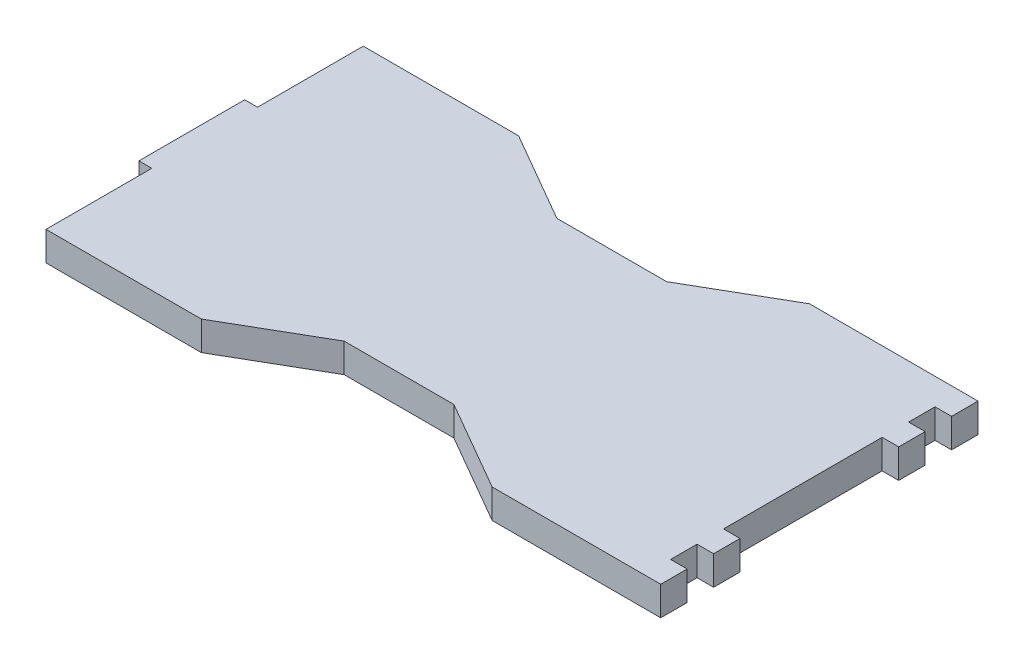
ISO-10303-21;
HEADER;
FILE_DESCRIPTION(('STEP AP214'),'2;1');
FILE_NAME('part.step','',(''),(''),'','','');
FILE_SCHEMA(('AUTOMOTIVE_DESIGN { 1 0 10303 214 1 1 1 1 }'));
ENDSEC;
DATA;
#1=APPLICATION_CONTEXT('core data for automotive mechanical design processes');
#2=APPLICATION_PROTOCOL_DEFINITION('international standard','automotive_design',2000,#1);
#3=PRODUCT_CONTEXT('',#1,'mechanical');
#4=PRODUCT('Part','Part','',(#3));
#5=PRODUCT_RELATED_PRODUCT_CATEGORY('part','',(#4));
#6=PRODUCT_DEFINITION_FORMATION('','',#4);
#7=PRODUCT_DEFINITION_CONTEXT('part definition',#1,'design');
#8=PRODUCT_DEFINITION('design','',#6,#7);
#9=PRODUCT_DEFINITION_SHAPE('','',#8);
#10=(LENGTH_UNIT() NAMED_UNIT(*) SI_UNIT(.MILLI.,.METRE.));
#11=(NAMED_UNIT(*) PLANE_ANGLE_UNIT() SI_UNIT($,.RADIAN.));
#12=(NAMED_UNIT(*) SI_UNIT($,.STERADIAN.) SOLID_ANGLE_UNIT());
#13=UNCERTAINTY_MEASURE_WITH_UNIT(LENGTH_MEASURE(1.E-05),#10,'distance_accuracy_value','');
#14=(GEOMETRIC_REPRESENTATION_CONTEXT(3) GLOBAL_UNCERTAINTY_ASSIGNED_CONTEXT((#13)) GLOBAL_UNIT_ASSIGNED_CONTEXT((#10,
#11,#12)) REPRESENTATION_CONTEXT('',''));
#15=CARTESIAN_POINT('',(0.,0.,0.));
#16=DIRECTION('',(0.,0.,1.));
#17=DIRECTION('',(1.,0.,0.));
#18=AXIS2_PLACEMENT_3D('',#15,#16,#17);
#19=CARTESIAN_POINT('',(0.,2.2,-5.32952119277333));
#20=DIRECTION('',(0.,0.,1.));
#21=DIRECTION('',(1.,0.,0.));
#22=AXIS2_PLACEMENT_3D('',#19,#20,#21);
#23=PLANE('',#22);
#24=DIRECTION('',(-1.,0.,0.));
#25=VECTOR('',#24,1.);
#26=CARTESIAN_POINT('',(0.,0.,-5.32952119277333));
#27=LINE('',#26,#25);
#28=CARTESIAN_POINT('',(-43.0000000000031,0.,-5.32952119277333));
#29=VERTEX_POINT('',#28);
#30=CARTESIAN_POINT('',(-44.2500000000012,0.,-5.32952119277333));
#31=VERTEX_POINT('',#30);
#32=EDGE_CURVE('E253',#29,#31,#27,.T.);
#33=ORIENTED_EDGE('',*,*,#32,.F.);
#34=DIRECTION('',(0.,-1.,0.));
#35=VECTOR('',#34,1.);
#36=CARTESIAN_POINT('',(-43.0000000000031,2.2,-5.32952119277333));
#37=LINE('',#36,#35);
#38=CARTESIAN_POINT('',(-43.0000000000031,2.2,-5.32952119277333));
#39=VERTEX_POINT('',#38);
#40=EDGE_CURVE('E11',#39,#29,#37,.T.);
#41=ORIENTED_EDGE('',*,*,#40,.F.);
#42=DIRECTION('',(-1.,0.,0.));
#43=VECTOR('',#42,1.);
#44=CARTESIAN_POINT('',(0.,2.2,-5.32952119277333));
#45=LINE('',#44,#43);
#46=CARTESIAN_POINT('',(-44.2500000000012,2.2,-5.32952119277333));
#47=VERTEX_POINT('',#46);
#48=EDGE_CURVE('E324',#39,#47,#45,.T.);
#49=ORIENTED_EDGE('',*,*,#48,.T.);
#50=DIRECTION('',(0.,-1.,0.));
#51=VECTOR('',#50,1.);
#52=CARTESIAN_POINT('',(-44.2500000000012,2.2,-5.32952119277333));
#53=LINE('',#52,#51);
#54=EDGE_CURVE('E147',#47,#31,#53,.T.);
#55=ORIENTED_EDGE('',*,*,#54,.T.);
#56=EDGE_LOOP('',(#33,#41,#49,#55));
#57=FACE_BOUND('',#56,.T.);
#58=ADVANCED_FACE('F37',(#57),#23,.T.);
#59=CARTESIAN_POINT('',(-42.9999999999982,2.2,2.57594871359193E-11));
#60=DIRECTION('',(-1.,0.,5.99057840370243E-13));
#61=DIRECTION('',(5.99057840370243E-13,0.,1.));
#62=AXIS2_PLACEMENT_3D('',#59,#60,#61);
#63=PLANE('',#62);
#64=DIRECTION('',(-5.99057840370243E-13,0.,-1.));
#65=VECTOR('',#64,1.);
#66=CARTESIAN_POINT('',(-42.9999999999982,0.,2.57594871359193E-11));
#67=LINE('',#66,#65);
#68=CARTESIAN_POINT('',(-43.0000000000031,0.,-7.32952119277339));
#69=VERTEX_POINT('',#68);
#70=EDGE_CURVE('E256',#29,#69,#67,.T.);
#71=ORIENTED_EDGE('',*,*,#70,.T.);
#72=DIRECTION('',(0.,-1.,0.));
#73=VECTOR('',#72,1.);
#74=CARTESIAN_POINT('',(-43.0000000000031,2.2,-7.32952119277339));
#75=LINE('',#74,#73);
#76=CARTESIAN_POINT('',(-43.0000000000031,2.2,-7.32952119277339));
#77=VERTEX_POINT('',#76);
#78=EDGE_CURVE('E45',#77,#69,#75,.T.);
#79=ORIENTED_EDGE('',*,*,#78,.F.);
#80=DIRECTION('',(-5.99057840370243E-13,0.,-1.));
#81=VECTOR('',#80,1.);
#82=CARTESIAN_POINT('',(-42.9999999999982,2.2,2.57594871359193E-11));
#83=LINE('',#82,#81);
#84=EDGE_CURVE('E399',#39,#77,#83,.T.);
#85=ORIENTED_EDGE('',*,*,#84,.F.);
#86=ORIENTED_EDGE('',*,*,#40,.T.);
#87=EDGE_LOOP('',(#71,#79,#85,#86));
#88=FACE_BOUND('',#87,.T.);
#89=ADVANCED_FACE('F386',(#88),#63,.F.);
#90=CARTESIAN_POINT('',(0.,2.2,-7.32952119277339));
#91=DIRECTION('',(0.,0.,-1.));
#92=DIRECTION('',(-1.,0.,0.));
#93=AXIS2_PLACEMENT_3D('',#90,#91,#92);
#94=PLANE('',#93);
#95=DIRECTION('',(1.,0.,0.));
#96=VECTOR('',#95,1.);
#97=CARTESIAN_POINT('',(0.,0.,-7.32952119277339));
#98=LINE('',#97,#96);
#99=CARTESIAN_POINT('',(-44.2500000000011,0.,-7.32952119277339));
#100=VERTEX_POINT('',#99);
#101=EDGE_CURVE('E259',#100,#69,#98,.T.);
#102=ORIENTED_EDGE('',*,*,#101,.F.);
#103=DIRECTION('',(0.,-1.,0.));
#104=VECTOR('',#103,1.);
#105=CARTESIAN_POINT('',(-44.2500000000011,2.2,-7.32952119277339));
#106=LINE('',#105,#104);
#107=CARTESIAN_POINT('',(-44.2500000000011,2.2,-7.32952119277339));
#108=VERTEX_POINT('',#107);
#109=EDGE_CURVE('E376',#108,#100,#106,.T.);
#110=ORIENTED_EDGE('',*,*,#109,.F.);
#111=DIRECTION('',(1.,0.,0.));
#112=VECTOR('',#111,1.);
#113=CARTESIAN_POINT('',(0.,2.2,-7.32952119277339));
#114=LINE('',#113,#112);
#115=EDGE_CURVE('E383',#108,#77,#114,.T.);
#116=ORIENTED_EDGE('',*,*,#115,.T.);
#117=ORIENTED_EDGE('',*,*,#78,.T.);
#118=EDGE_LOOP('',(#102,#110,#116,#117));
#119=FACE_BOUND('',#118,.T.);
#120=ADVANCED_FACE('F381',(#119),#94,.T.);
#121=CARTESIAN_POINT('',(-44.2500000000011,2.2,0.));
#122=DIRECTION('',(1.,0.,0.));
#123=DIRECTION('',(0.,0.,-1.));
#124=AXIS2_PLACEMENT_3D('',#121,#122,#123);
#125=PLANE('',#124);
#126=DIRECTION('',(0.,0.,1.));
#127=VECTOR('',#126,1.);
#128=CARTESIAN_POINT('',(-44.2500000000011,0.,0.));
#129=LINE('',#128,#127);
#130=CARTESIAN_POINT('',(-44.2500000000011,0.,-9.32952119277333));
#131=VERTEX_POINT('',#130);
#132=EDGE_CURVE('E263',#131,#100,#129,.T.);
#133=ORIENTED_EDGE('',*,*,#132,.F.);
#134=DIRECTION('',(0.,-1.,0.));
#135=VECTOR('',#134,1.);
#136=CARTESIAN_POINT('',(-44.2500000000011,2.2,-9.32952119277333));
#137=LINE('',#136,#135);
#138=CARTESIAN_POINT('',(-44.2500000000011,2.2,-9.32952119277333));
#139=VERTEX_POINT('',#138);
#140=EDGE_CURVE('E374',#139,#131,#137,.T.);
#141=ORIENTED_EDGE('',*,*,#140,.F.);
#142=DIRECTION('',(0.,0.,1.));
#143=VECTOR('',#142,1.);
#144=CARTESIAN_POINT('',(-44.2500000000011,2.2,0.));
#145=LINE('',#144,#143);
#146=EDGE_CURVE('E396',#139,#108,#145,.T.);
#147=ORIENTED_EDGE('',*,*,#146,.T.);
#148=ORIENTED_EDGE('',*,*,#109,.T.);
#149=EDGE_LOOP('',(#133,#141,#147,#148));
#150=FACE_BOUND('',#149,.T.);
#151=ADVANCED_FACE('F393',(#150),#125,.T.);
#152=CARTESIAN_POINT('',(0.,2.2,-9.32952119277333));
#153=DIRECTION('',(0.,0.,1.));
#154=DIRECTION('',(1.,0.,0.));
#155=AXIS2_PLACEMENT_3D('',#152,#153,#154);
#156=PLANE('',#155);
#157=DIRECTION('',(-1.,0.,0.));
#158=VECTOR('',#157,1.);
#159=CARTESIAN_POINT('',(0.,0.,-9.32952119277333));
#160=LINE('',#159,#158);
#161=CARTESIAN_POINT('',(-43.0000000000031,0.,-9.32952119277333));
#162=VERTEX_POINT('',#161);
#163=EDGE_CURVE('E266',#162,#131,#160,.T.);
#164=ORIENTED_EDGE('',*,*,#163,.F.);
#165=DIRECTION('',(0.,-1.,0.));
#166=VECTOR('',#165,1.);
#167=CARTESIAN_POINT('',(-43.0000000000031,2.2,-9.32952119277333));
#168=LINE('',#167,#166);
#169=CARTESIAN_POINT('',(-43.0000000000031,2.2,-9.32952119277333));
#170=VERTEX_POINT('',#169);
#171=EDGE_CURVE('E372',#170,#162,#168,.T.);
#172=ORIENTED_EDGE('',*,*,#171,.F.);
#173=DIRECTION('',(-1.,0.,0.));
#174=VECTOR('',#173,1.);
#175=CARTESIAN_POINT('',(0.,2.2,-9.32952119277333));
#176=LINE('',#175,#174);
#177=EDGE_CURVE('E401',#170,#139,#176,.T.);
#178=ORIENTED_EDGE('',*,*,#177,.T.);
#179=ORIENTED_EDGE('',*,*,#140,.T.);
#180=EDGE_LOOP('',(#164,#172,#178,#179));
#181=FACE_BOUND('',#180,.T.);
#182=ADVANCED_FACE('F474',(#181),#156,.T.);
#183=CARTESIAN_POINT('',(-43.0000000000049,0.,-11.3295211927775));
#184=VERTEX_POINT('',#183);
#185=EDGE_CURVE('E260',#162,#184,#67,.T.);
#186=ORIENTED_EDGE('',*,*,#185,.T.);
#187=DIRECTION('',(0.,-1.,0.));
#188=VECTOR('',#187,1.);
#189=CARTESIAN_POINT('',(-43.0000000000049,2.2,-11.3295211927775));
#190=LINE('',#189,#188);
#191=CARTESIAN_POINT('',(-43.0000000000049,2.2,-11.3295211927775));
#192=VERTEX_POINT('',#191);
#193=EDGE_CURVE('E369',#192,#184,#190,.T.);
#194=ORIENTED_EDGE('',*,*,#193,.F.);
#195=EDGE_CURVE('E404',#170,#192,#83,.T.);
#196=ORIENTED_EDGE('',*,*,#195,.F.);
#197=ORIENTED_EDGE('',*,*,#171,.T.);
#198=EDGE_LOOP('',(#186,#194,#196,#197));
#199=FACE_BOUND('',#198,.T.);
#200=ADVANCED_FACE('F466',(#199),#63,.F.);
#201=CARTESIAN_POINT('',(5.91919778175046E-13,2.2,-11.3295211927752));
#202=DIRECTION('',(0.,0.,1.));
#203=DIRECTION('',(1.,0.,0.));
#204=AXIS2_PLACEMENT_3D('',#201,#202,#203);
#205=PLANE('',#204);
#206=DIRECTION('',(-1.,0.,0.));
#207=VECTOR('',#206,1.);
#208=CARTESIAN_POINT('',(5.91919778175046E-13,0.,-11.3295211927752));
#209=LINE('',#208,#207);
#210=CARTESIAN_POINT('',(-55.7499999999826,0.,-11.3295211927782));
#211=VERTEX_POINT('',#210);
#212=EDGE_CURVE('E269',#184,#211,#209,.T.);
#213=ORIENTED_EDGE('',*,*,#212,.T.);
#214=DIRECTION('',(0.,-1.,0.));
#215=VECTOR('',#214,1.);
#216=CARTESIAN_POINT('',(-55.7499999999826,2.2,-11.3295211927782));
#217=LINE('',#216,#215);
#218=CARTESIAN_POINT('',(-55.7499999999826,2.2,-11.3295211927782));
#219=VERTEX_POINT('',#218);
#220=EDGE_CURVE('E366',#219,#211,#217,.T.);
#221=ORIENTED_EDGE('',*,*,#220,.F.);
#222=DIRECTION('',(-1.,0.,0.));
#223=VECTOR('',#222,1.);
#224=CARTESIAN_POINT('',(5.91919778175046E-13,2.2,-11.3295211927752));
#225=LINE('',#224,#223);
#226=EDGE_CURVE('E408',#192,#219,#225,.T.);
#227=ORIENTED_EDGE('',*,*,#226,.F.);
#228=ORIENTED_EDGE('',*,*,#193,.T.);
#229=EDGE_LOOP('',(#213,#221,#227,#228));
#230=FACE_BOUND('',#229,.T.);
#231=ADVANCED_FACE('F473',(#230),#205,.F.);
#232=CARTESIAN_POINT('',(-18.8433265828452,2.2,-32.6375990250739));
#233=DIRECTION('',(0.500000000000314,0.,0.866025403784257));
#234=DIRECTION('',(0.866025403784257,0.,-0.500000000000314));
#235=AXIS2_PLACEMENT_3D('',#232,#233,#234);
#236=PLANE('',#235);
#237=DIRECTION('',(-0.866025403784257,0.,0.500000000000314));
#238=VECTOR('',#237,1.);
#239=CARTESIAN_POINT('',(-18.8433265828452,0.,-32.6375990250739));
#240=LINE('',#239,#238);
#241=CARTESIAN_POINT('',(-62.6001419038731,0.,-7.37458992057657));
#242=VERTEX_POINT('',#241);
#243=EDGE_CURVE('E271',#211,#242,#240,.T.);
#244=ORIENTED_EDGE('',*,*,#243,.T.);
#245=DIRECTION('',(0.,-1.,0.));
#246=VECTOR('',#245,1.);
#247=CARTESIAN_POINT('',(-62.6001419038731,2.2,-7.37458992057657));
#248=LINE('',#247,#246);
#249=CARTESIAN_POINT('',(-62.6001419038731,2.2,-7.37458992057657));
#250=VERTEX_POINT('',#249);
#251=EDGE_CURVE('E364',#250,#242,#248,.T.);
#252=ORIENTED_EDGE('',*,*,#251,.F.);
#253=DIRECTION('',(-0.866025403784257,0.,0.500000000000314));
#254=VECTOR('',#253,1.);
#255=CARTESIAN_POINT('',(-18.8433265828452,2.2,-32.6375990250739));
#256=LINE('',#255,#254);
#257=EDGE_CURVE('E410',#219,#250,#256,.T.);
#258=ORIENTED_EDGE('',*,*,#257,.F.);
#259=ORIENTED_EDGE('',*,*,#220,.T.);
#260=EDGE_LOOP('',(#244,#252,#258,#259));
#261=FACE_BOUND('',#260,.T.);
#262=ADVANCED_FACE('F480',(#261),#236,.F.);
#263=CARTESIAN_POINT('',(0.,2.2,-7.37458992057657));
#264=DIRECTION('',(0.,0.,-1.));
#265=DIRECTION('',(-1.,0.,0.));
#266=AXIS2_PLACEMENT_3D('',#263,#264,#265);
#267=PLANE('',#266);
#268=DIRECTION('',(1.,0.,0.));
#269=VECTOR('',#268,1.);
#270=CARTESIAN_POINT('',(0.,0.,-7.37458992057657));
#271=LINE('',#270,#269);
#272=CARTESIAN_POINT('',(-70.8998580960841,0.,-7.37458992057656));
#273=VERTEX_POINT('',#272);
#274=EDGE_CURVE('E274',#273,#242,#271,.T.);
#275=ORIENTED_EDGE('',*,*,#274,.F.);
#276=DIRECTION('',(0.,-1.,0.));
#277=VECTOR('',#276,1.);
#278=CARTESIAN_POINT('',(-70.8998580960841,2.2,-7.37458992057656));
#279=LINE('',#278,#277);
#280=CARTESIAN_POINT('',(-70.8998580960841,2.2,-7.37458992057656));
#281=VERTEX_POINT('',#280);
#282=EDGE_CURVE('E362',#281,#273,#279,.T.);
#283=ORIENTED_EDGE('',*,*,#282,.F.);
#284=DIRECTION('',(1.,0.,0.));
#285=VECTOR('',#284,1.);
#286=CARTESIAN_POINT('',(0.,2.2,-7.37458992057657));
#287=LINE('',#286,#285);
#288=EDGE_CURVE('E412',#281,#250,#287,.T.);
#289=ORIENTED_EDGE('',*,*,#288,.T.);
#290=ORIENTED_EDGE('',*,*,#251,.T.);
#291=EDGE_LOOP('',(#275,#283,#289,#290));
#292=FACE_BOUND('',#291,.T.);
#293=ADVANCED_FACE('F566',(#292),#267,.T.);
#294=CARTESIAN_POINT('',(-14.5316734171651,2.2,25.1695966775279));
#295=DIRECTION('',(0.5,0.,-0.866025403784438));
#296=DIRECTION('',(-0.866025403784439,0.,-0.5));
#297=AXIS2_PLACEMENT_3D('',#294,#295,#296);
#298=PLANE('',#297);
#299=DIRECTION('',(0.866025403784439,0.,0.5));
#300=VECTOR('',#299,1.);
#301=CARTESIAN_POINT('',(-14.5316734171651,0.,25.1695966775279));
#302=LINE('',#301,#300);
#303=CARTESIAN_POINT('',(-77.7499999999737,0.,-11.3295211927743));
#304=VERTEX_POINT('',#303);
#305=EDGE_CURVE('E277',#304,#273,#302,.T.);
#306=ORIENTED_EDGE('',*,*,#305,.F.);
#307=DIRECTION('',(0.,-1.,0.));
#308=VECTOR('',#307,1.);
#309=CARTESIAN_POINT('',(-77.7499999999737,2.2,-11.3295211927743));
#310=LINE('',#309,#308);
#311=CARTESIAN_POINT('',(-77.7499999999737,2.2,-11.3295211927743));
#312=VERTEX_POINT('',#311);
#313=EDGE_CURVE('E360',#312,#304,#310,.T.);
#314=ORIENTED_EDGE('',*,*,#313,.F.);
#315=DIRECTION('',(0.866025403784439,0.,0.5));
#316=VECTOR('',#315,1.);
#317=CARTESIAN_POINT('',(-14.5316734171651,2.2,25.1695966775279));
#318=LINE('',#317,#316);
#319=EDGE_CURVE('E415',#312,#281,#318,.T.);
#320=ORIENTED_EDGE('',*,*,#319,.T.);
#321=ORIENTED_EDGE('',*,*,#282,.T.);
#322=EDGE_LOOP('',(#306,#314,#320,#321));
#323=FACE_BOUND('',#322,.T.);
#324=ADVANCED_FACE('F498',(#323),#298,.T.);
#325=CARTESIAN_POINT('',(0.,2.2,-11.3295211927743));
#326=DIRECTION('',(0.,0.,1.));
#327=DIRECTION('',(1.,0.,0.));
#328=AXIS2_PLACEMENT_3D('',#325,#326,#327);
#329=PLANE('',#328);
#330=DIRECTION('',(-1.,0.,0.));
#331=VECTOR('',#330,1.);
#332=CARTESIAN_POINT('',(0.,0.,-11.3295211927743));
#333=LINE('',#332,#331);
#334=CARTESIAN_POINT('',(-89.4999999999611,0.,-11.3295211927743));
#335=VERTEX_POINT('',#334);
#336=EDGE_CURVE('E280',#304,#335,#333,.T.);
#337=ORIENTED_EDGE('',*,*,#336,.T.);
#338=DIRECTION('',(0.,-1.,0.));
#339=VECTOR('',#338,1.);
#340=CARTESIAN_POINT('',(-89.4999999999611,2.2,-11.3295211927743));
#341=LINE('',#340,#339);
#342=CARTESIAN_POINT('',(-89.4999999999611,2.2,-11.3295211927743));
#343=VERTEX_POINT('',#342);
#344=EDGE_CURVE('E358',#343,#335,#341,.T.);
#345=ORIENTED_EDGE('',*,*,#344,.F.);
#346=DIRECTION('',(-1.,0.,0.));
#347=VECTOR('',#346,1.);
#348=CARTESIAN_POINT('',(0.,2.2,-11.3295211927743));
#349=LINE('',#348,#347);
#350=EDGE_CURVE('E418',#312,#343,#349,.T.);
#351=ORIENTED_EDGE('',*,*,#350,.F.);
#352=ORIENTED_EDGE('',*,*,#313,.T.);
#353=EDGE_LOOP('',(#337,#345,#351,#352));
#354=FACE_BOUND('',#353,.T.);
#355=ADVANCED_FACE('F503',(#354),#329,.F.);
#356=CARTESIAN_POINT('',(-89.4999999999612,2.2,-6.21031004399431E-13));
#357=DIRECTION('',(-1.,0.,0.));
#358=DIRECTION('',(0.,0.,1.));
#359=AXIS2_PLACEMENT_3D('',#356,#357,#358);
#360=PLANE('',#359);
#361=DIRECTION('',(0.,0.,-1.));
#362=VECTOR('',#361,1.);
#363=CARTESIAN_POINT('',(-89.4999999999612,0.,-6.21031004399431E-13));
#364=LINE('',#363,#362);
#365=CARTESIAN_POINT('',(-89.4999999999611,0.,-3.32952119277859));
#366=VERTEX_POINT('',#365);
#367=EDGE_CURVE('E283',#366,#335,#364,.T.);
#368=ORIENTED_EDGE('',*,*,#367,.F.);
#369=DIRECTION('',(0.,-1.,0.));
#370=VECTOR('',#369,1.);
#371=CARTESIAN_POINT('',(-89.4999999999611,2.2,-3.32952119277859));
#372=LINE('',#371,#370);
#373=CARTESIAN_POINT('',(-89.4999999999611,2.2,-3.32952119277859));
#374=VERTEX_POINT('',#373);
#375=EDGE_CURVE('E356',#374,#366,#372,.T.);
#376=ORIENTED_EDGE('',*,*,#375,.F.);
#377=DIRECTION('',(0.,0.,-1.));
#378=VECTOR('',#377,1.);
#379=CARTESIAN_POINT('',(-89.4999999999612,2.2,-6.21031004399431E-13));
#380=LINE('',#379,#378);
#381=EDGE_CURVE('E420',#374,#343,#380,.T.);
#382=ORIENTED_EDGE('',*,*,#381,.T.);
#383=ORIENTED_EDGE('',*,*,#344,.T.);
#384=EDGE_LOOP('',(#368,#376,#382,#383));
#385=FACE_BOUND('',#384,.T.);
#386=ADVANCED_FACE('F553',(#385),#360,.T.);
#387=CARTESIAN_POINT('',(0.,2.2,-3.32952119277859));
#388=DIRECTION('',(0.,0.,-1.));
#389=DIRECTION('',(-1.,0.,0.));
#390=AXIS2_PLACEMENT_3D('',#387,#388,#389);
#391=PLANE('',#390);
#392=DIRECTION('',(1.,0.,0.));
#393=VECTOR('',#392,1.);
#394=CARTESIAN_POINT('',(0.,0.,-3.32952119277859));
#395=LINE('',#394,#393);
#396=CARTESIAN_POINT('',(-90.4737811225465,0.,-3.32952119277859));
#397=VERTEX_POINT('',#396);
#398=EDGE_CURVE('E286',#397,#366,#395,.T.);
#399=ORIENTED_EDGE('',*,*,#398,.F.);
#400=DIRECTION('',(0.,-1.,0.));
#401=VECTOR('',#400,1.);
#402=CARTESIAN_POINT('',(-90.4737811225465,2.2,-3.32952119277859));
#403=LINE('',#402,#401);
#404=CARTESIAN_POINT('',(-90.4737811225465,2.2,-3.32952119277859));
#405=VERTEX_POINT('',#404);
#406=EDGE_CURVE('E354',#405,#397,#403,.T.);
#407=ORIENTED_EDGE('',*,*,#406,.F.);
#408=DIRECTION('',(1.,0.,0.));
#409=VECTOR('',#408,1.);
#410=CARTESIAN_POINT('',(0.,2.2,-3.32952119277859));
#411=LINE('',#410,#409);
#412=EDGE_CURVE('E423',#405,#374,#411,.T.);
#413=ORIENTED_EDGE('',*,*,#412,.T.);
#414=ORIENTED_EDGE('',*,*,#375,.T.);
#415=EDGE_LOOP('',(#399,#407,#413,#414));
#416=FACE_BOUND('',#415,.T.);
#417=ADVANCED_FACE('F510',(#416),#391,.T.);
#418=CARTESIAN_POINT('',(-90.4737811225465,2.2,-8.37050624392918E-13));
#419=DIRECTION('',(-1.,0.,0.));
#420=DIRECTION('',(0.,0.,1.));
#421=AXIS2_PLACEMENT_3D('',#418,#419,#420);
#422=PLANE('',#421);
#423=DIRECTION('',(0.,0.,-1.));
#424=VECTOR('',#423,1.);
#425=CARTESIAN_POINT('',(-90.4737811225465,0.,-8.37050624392918E-13));
#426=LINE('',#425,#424);
#427=CARTESIAN_POINT('',(-90.4737811225465,0.,4.67047880722148));
#428=VERTEX_POINT('',#427);
#429=EDGE_CURVE('E289',#428,#397,#426,.T.);
#430=ORIENTED_EDGE('',*,*,#429,.F.);
#431=DIRECTION('',(0.,-1.,0.));
#432=VECTOR('',#431,1.);
#433=CARTESIAN_POINT('',(-90.4737811225465,2.2,4.67047880722148));
#434=LINE('',#433,#432);
#435=CARTESIAN_POINT('',(-90.4737811225465,2.2,4.67047880722148));
#436=VERTEX_POINT('',#435);
#437=EDGE_CURVE('E352',#436,#428,#434,.T.);
#438=ORIENTED_EDGE('',*,*,#437,.F.);
#439=DIRECTION('',(0.,0.,-1.));
#440=VECTOR('',#439,1.);
#441=CARTESIAN_POINT('',(-90.4737811225465,2.2,-8.37050624392918E-13));
#442=LINE('',#441,#440);
#443=EDGE_CURVE('E426',#436,#405,#442,.T.);
#444=ORIENTED_EDGE('',*,*,#443,.T.);
#445=ORIENTED_EDGE('',*,*,#406,.T.);
#446=EDGE_LOOP('',(#430,#438,#444,#445));
#447=FACE_BOUND('',#446,.T.);
#448=ADVANCED_FACE('F514',(#447),#422,.T.);
#449=CARTESIAN_POINT('',(0.,2.2,4.67047880722148));
#450=DIRECTION('',(0.,0.,1.));
#451=DIRECTION('',(1.,0.,0.));
#452=AXIS2_PLACEMENT_3D('',#449,#450,#451);
#453=PLANE('',#452);
#454=DIRECTION('',(-1.,0.,0.));
#455=VECTOR('',#454,1.);
#456=CARTESIAN_POINT('',(0.,0.,4.67047880722148));
#457=LINE('',#456,#455);
#458=CARTESIAN_POINT('',(-89.4999999999614,0.,4.67047880722148));
#459=VERTEX_POINT('',#458);
#460=EDGE_CURVE('E292',#459,#428,#457,.T.);
#461=ORIENTED_EDGE('',*,*,#460,.F.);
#462=DIRECTION('',(0.,-1.,0.));
#463=VECTOR('',#462,1.);
#464=CARTESIAN_POINT('',(-89.4999999999614,2.2,4.67047880722148));
#465=LINE('',#464,#463);
#466=CARTESIAN_POINT('',(-89.4999999999614,2.2,4.67047880722148));
#467=VERTEX_POINT('',#466);
#468=EDGE_CURVE('E350',#467,#459,#465,.T.);
#469=ORIENTED_EDGE('',*,*,#468,.F.);
#470=DIRECTION('',(-1.,0.,0.));
#471=VECTOR('',#470,1.);
#472=CARTESIAN_POINT('',(0.,2.2,4.67047880722148));
#473=LINE('',#472,#471);
#474=EDGE_CURVE('E429',#467,#436,#473,.T.);
#475=ORIENTED_EDGE('',*,*,#474,.T.);
#476=ORIENTED_EDGE('',*,*,#437,.T.);
#477=EDGE_LOOP('',(#461,#469,#475,#476));
#478=FACE_BOUND('',#477,.T.);
#479=ADVANCED_FACE('F519',(#478),#453,.T.);
#480=CARTESIAN_POINT('',(-89.4999999999614,2.2,-6.21031004399428E-13));
#481=DIRECTION('',(-1.,0.,0.));
#482=DIRECTION('',(0.,0.,1.));
#483=AXIS2_PLACEMENT_3D('',#480,#481,#482);
#484=PLANE('',#483);
#485=DIRECTION('',(0.,0.,-1.));
#486=VECTOR('',#485,1.);
#487=CARTESIAN_POINT('',(-89.4999999999614,0.,-6.21031004399428E-13));
#488=LINE('',#487,#486);
#489=CARTESIAN_POINT('',(-89.4999999999615,0.,12.6704788072289));
#490=VERTEX_POINT('',#489);
#491=EDGE_CURVE('E295',#490,#459,#488,.T.);
#492=ORIENTED_EDGE('',*,*,#491,.F.);
#493=DIRECTION('',(0.,-1.,0.));
#494=VECTOR('',#493,1.);
#495=CARTESIAN_POINT('',(-89.4999999999615,2.2,12.6704788072289));
#496=LINE('',#495,#494);
#497=CARTESIAN_POINT('',(-89.4999999999615,2.2,12.6704788072289));
#498=VERTEX_POINT('',#497);
#499=EDGE_CURVE('E348',#498,#490,#496,.T.);
#500=ORIENTED_EDGE('',*,*,#499,.F.);
#501=DIRECTION('',(0.,0.,-1.));
#502=VECTOR('',#501,1.);
#503=CARTESIAN_POINT('',(-89.4999999999614,2.2,-6.21031004399428E-13));
#504=LINE('',#503,#502);
#505=EDGE_CURVE('E432',#498,#467,#504,.T.);
#506=ORIENTED_EDGE('',*,*,#505,.T.);
#507=ORIENTED_EDGE('',*,*,#468,.T.);
#508=EDGE_LOOP('',(#492,#500,#506,#507));
#509=FACE_BOUND('',#508,.T.);
#510=ADVANCED_FACE('F522',(#509),#484,.T.);
#511=CARTESIAN_POINT('',(0.,2.2,12.6704788072289));
#512=DIRECTION('',(0.,0.,1.));
#513=DIRECTION('',(1.,0.,0.));
#514=AXIS2_PLACEMENT_3D('',#511,#512,#513);
#515=PLANE('',#514);
#516=DIRECTION('',(-1.,0.,0.));
#517=VECTOR('',#516,1.);
#518=CARTESIAN_POINT('',(0.,0.,12.6704788072289));
#519=LINE('',#518,#517);
#520=CARTESIAN_POINT('',(-77.7499999999753,0.,12.6704788072289));
#521=VERTEX_POINT('',#520);
#522=EDGE_CURVE('E298',#521,#490,#519,.T.);
#523=ORIENTED_EDGE('',*,*,#522,.F.);
#524=DIRECTION('',(0.,-1.,0.));
#525=VECTOR('',#524,1.);
#526=CARTESIAN_POINT('',(-77.7499999999753,2.2,12.6704788072289));
#527=LINE('',#526,#525);
#528=CARTESIAN_POINT('',(-77.7499999999753,2.2,12.6704788072289));
#529=VERTEX_POINT('',#528);
#530=EDGE_CURVE('E346',#529,#521,#527,.T.);
#531=ORIENTED_EDGE('',*,*,#530,.F.);
#532=DIRECTION('',(-1.,0.,0.));
#533=VECTOR('',#532,1.);
#534=CARTESIAN_POINT('',(0.,2.2,12.6704788072289));
#535=LINE('',#534,#533);
#536=EDGE_CURVE('E435',#529,#498,#535,.T.);
#537=ORIENTED_EDGE('',*,*,#536,.T.);
#538=ORIENTED_EDGE('',*,*,#499,.T.);
#539=EDGE_LOOP('',(#523,#531,#537,#538));
#540=FACE_BOUND('',#539,.T.);
#541=ADVANCED_FACE('F526',(#540),#515,.T.);
#542=CARTESIAN_POINT('',(-13.9510217374075,2.2,-24.1638784666876));
#543=DIRECTION('',(-0.5,0.,-0.866025403784439));
#544=DIRECTION('',(-0.866025403784439,0.,0.5));
#545=AXIS2_PLACEMENT_3D('',#542,#543,#544);
#546=PLANE('',#545);
#547=DIRECTION('',(0.866025403784439,0.,-0.5));
#548=VECTOR('',#547,1.);
#549=CARTESIAN_POINT('',(-13.9510217374075,0.,-24.1638784666876));
#550=LINE('',#549,#548);
#551=CARTESIAN_POINT('',(-70.8998580960808,0.,8.71554753502834));
#552=VERTEX_POINT('',#551);
#553=EDGE_CURVE('E301',#521,#552,#550,.T.);
#554=ORIENTED_EDGE('',*,*,#553,.T.);
#555=DIRECTION('',(0.,-1.,0.));
#556=VECTOR('',#555,1.);
#557=CARTESIAN_POINT('',(-70.8998580960808,2.2,8.71554753502834));
#558=LINE('',#557,#556);
#559=CARTESIAN_POINT('',(-70.8998580960808,2.2,8.71554753502834));
#560=VERTEX_POINT('',#559);
#561=EDGE_CURVE('E343',#560,#552,#558,.T.);
#562=ORIENTED_EDGE('',*,*,#561,.F.);
#563=DIRECTION('',(0.866025403784439,0.,-0.5));
#564=VECTOR('',#563,1.);
#565=CARTESIAN_POINT('',(-13.9510217374075,2.2,-24.1638784666876));
#566=LINE('',#565,#564);
#567=EDGE_CURVE('E438',#529,#560,#566,.T.);
#568=ORIENTED_EDGE('',*,*,#567,.F.);
#569=ORIENTED_EDGE('',*,*,#530,.T.);
#570=EDGE_LOOP('',(#554,#562,#568,#569));
#571=FACE_BOUND('',#570,.T.);
#572=ADVANCED_FACE('F531',(#571),#546,.F.);
#573=CARTESIAN_POINT('',(0.,2.2,8.71554753502835));
#574=DIRECTION('',(0.,0.,-1.));
#575=DIRECTION('',(-1.,0.,0.));
#576=AXIS2_PLACEMENT_3D('',#573,#574,#575);
#577=PLANE('',#576);
#578=DIRECTION('',(1.,0.,0.));
#579=VECTOR('',#578,1.);
#580=CARTESIAN_POINT('',(0.,0.,8.71554753502835));
#581=LINE('',#580,#579);
#582=CARTESIAN_POINT('',(-62.60014190387,0.,8.71554753502835));
#583=VERTEX_POINT('',#582);
#584=EDGE_CURVE('E303',#552,#583,#581,.T.);
#585=ORIENTED_EDGE('',*,*,#584,.T.);
#586=DIRECTION('',(0.,-1.,0.));
#587=VECTOR('',#586,1.);
#588=CARTESIAN_POINT('',(-62.60014190387,2.2,8.71554753502835));
#589=LINE('',#588,#587);
#590=CARTESIAN_POINT('',(-62.60014190387,2.2,8.71554753502835));
#591=VERTEX_POINT('',#590);
#592=EDGE_CURVE('E341',#591,#583,#589,.T.);
#593=ORIENTED_EDGE('',*,*,#592,.F.);
#594=DIRECTION('',(1.,0.,0.));
#595=VECTOR('',#594,1.);
#596=CARTESIAN_POINT('',(0.,2.2,8.71554753502835));
#597=LINE('',#596,#595);
#598=EDGE_CURVE('E440',#560,#591,#597,.T.);
#599=ORIENTED_EDGE('',*,*,#598,.F.);
#600=ORIENTED_EDGE('',*,*,#561,.T.);
#601=EDGE_LOOP('',(#585,#593,#599,#600));
#602=FACE_BOUND('',#601,.T.);
#603=ADVANCED_FACE('F537',(#602),#577,.F.);
#604=CARTESIAN_POINT('',(-19.4239782625802,2.2,33.6433172359024));
#605=DIRECTION('',(-0.5,0.,0.866025403784438));
#606=DIRECTION('',(0.866025403784438,0.,0.5));
#607=AXIS2_PLACEMENT_3D('',#604,#605,#606);
#608=PLANE('',#607);
#609=DIRECTION('',(-0.866025403784438,0.,-0.5));
#610=VECTOR('',#609,1.);
#611=CARTESIAN_POINT('',(-19.4239782625802,0.,33.6433172359024));
#612=LINE('',#611,#610);
#613=CARTESIAN_POINT('',(-55.7499999999729,0.,12.6704788072305));
#614=VERTEX_POINT('',#613);
#615=EDGE_CURVE('E306',#614,#583,#612,.T.);
#616=ORIENTED_EDGE('',*,*,#615,.F.);
#617=DIRECTION('',(0.,-1.,0.));
#618=VECTOR('',#617,1.);
#619=CARTESIAN_POINT('',(-55.7499999999729,2.2,12.6704788072305));
#620=LINE('',#619,#618);
#621=CARTESIAN_POINT('',(-55.7499999999729,2.2,12.6704788072305));
#622=VERTEX_POINT('',#621);
#623=EDGE_CURVE('E339',#622,#614,#620,.T.);
#624=ORIENTED_EDGE('',*,*,#623,.F.);
#625=DIRECTION('',(-0.866025403784438,0.,-0.5));
#626=VECTOR('',#625,1.);
#627=CARTESIAN_POINT('',(-19.4239782625802,2.2,33.6433172359024));
#628=LINE('',#627,#626);
#629=EDGE_CURVE('E442',#622,#591,#628,.T.);
#630=ORIENTED_EDGE('',*,*,#629,.T.);
#631=ORIENTED_EDGE('',*,*,#592,.T.);
#632=EDGE_LOOP('',(#616,#624,#630,#631));
#633=FACE_BOUND('',#632,.T.);
#634=ADVANCED_FACE('F541',(#633),#608,.T.);
#635=CARTESIAN_POINT('',(2.07040880185171E-12,2.2,12.6704788072214));
#636=DIRECTION('',(1.63404148600265E-13,0.,1.));
#637=DIRECTION('',(1.,0.,-1.63404148600265E-13));
#638=AXIS2_PLACEMENT_3D('',#635,#636,#637);
#639=PLANE('',#638);
#640=DIRECTION('',(-1.,0.,1.63404148600265E-13));
#641=VECTOR('',#640,1.);
#642=CARTESIAN_POINT('',(2.07040880185171E-12,0.,12.6704788072214));
#643=LINE('',#642,#641);
#644=CARTESIAN_POINT('',(-43.0000000000049,0.,12.6704788072284));
#645=VERTEX_POINT('',#644);
#646=EDGE_CURVE('E309',#645,#614,#643,.T.);
#647=ORIENTED_EDGE('',*,*,#646,.F.);
#648=DIRECTION('',(0.,-1.,0.));
#649=VECTOR('',#648,1.);
#650=CARTESIAN_POINT('',(-43.0000000000049,2.2,12.6704788072284));
#651=LINE('',#650,#649);
#652=CARTESIAN_POINT('',(-43.0000000000049,2.2,12.6704788072284));
#653=VERTEX_POINT('',#652);
#654=EDGE_CURVE('E337',#653,#645,#651,.T.);
#655=ORIENTED_EDGE('',*,*,#654,.F.);
#656=DIRECTION('',(-1.,0.,1.63404148600265E-13));
#657=VECTOR('',#656,1.);
#658=CARTESIAN_POINT('',(2.07040880185171E-12,2.2,12.6704788072214));
#659=LINE('',#658,#657);
#660=EDGE_CURVE('E445',#653,#622,#659,.T.);
#661=ORIENTED_EDGE('',*,*,#660,.T.);
#662=ORIENTED_EDGE('',*,*,#623,.T.);
#663=EDGE_LOOP('',(#647,#655,#661,#662));
#664=FACE_BOUND('',#663,.T.);
#665=ADVANCED_FACE('F544',(#664),#639,.T.);
#666=CARTESIAN_POINT('',(-42.9999999999973,2.2,-2.57594871359293E-11));
#667=DIRECTION('',(-1.,0.,-5.99057840370485E-13));
#668=DIRECTION('',(-5.99057840370485E-13,0.,1.));
#669=AXIS2_PLACEMENT_3D('',#666,#667,#668);
#670=PLANE('',#669);
#671=DIRECTION('',(5.99057840370485E-13,0.,-1.));
#672=VECTOR('',#671,1.);
#673=CARTESIAN_POINT('',(-42.9999999999973,0.,-2.57594871359293E-11));
#674=LINE('',#673,#672);
#675=CARTESIAN_POINT('',(-43.0000000000037,0.,10.6704788072267));
#676=VERTEX_POINT('',#675);
#677=EDGE_CURVE('E312',#645,#676,#674,.T.);
#678=ORIENTED_EDGE('',*,*,#677,.T.);
#679=DIRECTION('',(0.,-1.,0.));
#680=VECTOR('',#679,1.);
#681=CARTESIAN_POINT('',(-43.0000000000037,2.2,10.6704788072267));
#682=LINE('',#681,#680);
#683=CARTESIAN_POINT('',(-43.0000000000037,2.2,10.6704788072267));
#684=VERTEX_POINT('',#683);
#685=EDGE_CURVE('E334',#684,#676,#682,.T.);
#686=ORIENTED_EDGE('',*,*,#685,.F.);
#687=DIRECTION('',(5.99057840370485E-13,0.,-1.));
#688=VECTOR('',#687,1.);
#689=CARTESIAN_POINT('',(-42.9999999999973,2.2,-2.57594871359293E-11));
#690=LINE('',#689,#688);
#691=EDGE_CURVE('E236',#653,#684,#690,.T.);
#692=ORIENTED_EDGE('',*,*,#691,.F.);
#693=ORIENTED_EDGE('',*,*,#654,.T.);
#694=EDGE_LOOP('',(#678,#686,#692,#693));
#695=FACE_BOUND('',#694,.T.);
#696=ADVANCED_FACE('F548',(#695),#670,.F.);
#697=CARTESIAN_POINT('',(0.,2.2,10.6704788072267));
#698=DIRECTION('',(0.,0.,1.));
#699=DIRECTION('',(1.,0.,0.));
#700=AXIS2_PLACEMENT_3D('',#697,#698,#699);
#701=PLANE('',#700);
#702=DIRECTION('',(-1.,0.,0.));
#703=VECTOR('',#702,1.);
#704=CARTESIAN_POINT('',(0.,0.,10.6704788072267));
#705=LINE('',#704,#703);
#706=CARTESIAN_POINT('',(-44.2500000000012,0.,10.6704788072267));
#707=VERTEX_POINT('',#706);
#708=EDGE_CURVE('E314',#676,#707,#705,.T.);
#709=ORIENTED_EDGE('',*,*,#708,.T.);
#710=DIRECTION('',(0.,-1.,0.));
#711=VECTOR('',#710,1.);
#712=CARTESIAN_POINT('',(-44.2500000000012,2.2,10.6704788072267));
#713=LINE('',#712,#711);
#714=CARTESIAN_POINT('',(-44.2500000000012,2.2,10.6704788072267));
#715=VERTEX_POINT('',#714);
#716=EDGE_CURVE('E331',#715,#707,#713,.T.);
#717=ORIENTED_EDGE('',*,*,#716,.F.);
#718=DIRECTION('',(-1.,0.,0.));
#719=VECTOR('',#718,1.);
#720=CARTESIAN_POINT('',(0.,2.2,10.6704788072267));
#721=LINE('',#720,#719);
#722=EDGE_CURVE('E448',#684,#715,#721,.T.);
#723=ORIENTED_EDGE('',*,*,#722,.F.);
#724=ORIENTED_EDGE('',*,*,#685,.T.);
#725=EDGE_LOOP('',(#709,#717,#723,#724));
#726=FACE_BOUND('',#725,.T.);
#727=ADVANCED_FACE('F552',(#726),#701,.F.);
#728=CARTESIAN_POINT('',(-44.2500000000012,2.2,0.));
#729=DIRECTION('',(-1.,0.,0.));
#730=DIRECTION('',(0.,0.,1.));
#731=AXIS2_PLACEMENT_3D('',#728,#729,#730);
#732=PLANE('',#731);
#733=DIRECTION('',(0.,0.,-1.));
#734=VECTOR('',#733,1.);
#735=CARTESIAN_POINT('',(-44.2500000000012,0.,0.));
#736=LINE('',#735,#734);
#737=CARTESIAN_POINT('',(-44.2500000000012,0.,8.67047880722663));
#738=VERTEX_POINT('',#737);
#739=EDGE_CURVE('E316',#707,#738,#736,.T.);
#740=ORIENTED_EDGE('',*,*,#739,.T.);
#741=DIRECTION('',(0.,-1.,0.));
#742=VECTOR('',#741,1.);
#743=CARTESIAN_POINT('',(-44.2500000000012,2.2,8.67047880722663));
#744=LINE('',#743,#742);
#745=CARTESIAN_POINT('',(-44.2500000000012,2.2,8.67047880722663));
#746=VERTEX_POINT('',#745);
#747=EDGE_CURVE('E328',#746,#738,#744,.T.);
#748=ORIENTED_EDGE('',*,*,#747,.F.);
#749=DIRECTION('',(0.,0.,-1.));
#750=VECTOR('',#749,1.);
#751=CARTESIAN_POINT('',(-44.2500000000012,2.2,0.));
#752=LINE('',#751,#750);
#753=EDGE_CURVE('E449',#715,#746,#752,.T.);
#754=ORIENTED_EDGE('',*,*,#753,.F.);
#755=ORIENTED_EDGE('',*,*,#716,.T.);
#756=EDGE_LOOP('',(#740,#748,#754,#755));
#757=FACE_BOUND('',#756,.T.);
#758=ADVANCED_FACE('F455',(#757),#732,.F.);
#759=CARTESIAN_POINT('',(0.,2.2,8.67047880722663));
#760=DIRECTION('',(0.,0.,-1.));
#761=DIRECTION('',(-1.,0.,0.));
#762=AXIS2_PLACEMENT_3D('',#759,#760,#761);
#763=PLANE('',#762);
#764=DIRECTION('',(1.,0.,0.));
#765=VECTOR('',#764,1.);
#766=CARTESIAN_POINT('',(0.,0.,8.67047880722663));
#767=LINE('',#766,#765);
#768=CARTESIAN_POINT('',(-43.0000000000025,0.,8.67047880722663));
#769=VERTEX_POINT('',#768);
#770=EDGE_CURVE('E318',#738,#769,#767,.T.);
#771=ORIENTED_EDGE('',*,*,#770,.T.);
#772=DIRECTION('',(0.,-1.,0.));
#773=VECTOR('',#772,1.);
#774=CARTESIAN_POINT('',(-43.0000000000025,2.2,8.67047880722663));
#775=LINE('',#774,#773);
#776=CARTESIAN_POINT('',(-43.0000000000025,2.2,8.67047880722663));
#777=VERTEX_POINT('',#776);
#778=EDGE_CURVE('E245',#777,#769,#775,.T.);
#779=ORIENTED_EDGE('',*,*,#778,.F.);
#780=DIRECTION('',(1.,0.,0.));
#781=VECTOR('',#780,1.);
#782=CARTESIAN_POINT('',(0.,2.2,8.67047880722663));
#783=LINE('',#782,#781);
#784=EDGE_CURVE('E231',#746,#777,#783,.T.);
#785=ORIENTED_EDGE('',*,*,#784,.F.);
#786=ORIENTED_EDGE('',*,*,#747,.T.);
#787=EDGE_LOOP('',(#771,#779,#785,#786));
#788=FACE_BOUND('',#787,.T.);
#789=ADVANCED_FACE('F459',(#788),#763,.F.);
#790=CARTESIAN_POINT('',(-43.0000000000031,0.,6.67047880722668));
#791=VERTEX_POINT('',#790);
#792=EDGE_CURVE('E241',#769,#791,#674,.T.);
#793=ORIENTED_EDGE('',*,*,#792,.T.);
#794=DIRECTION('',(0.,-1.,0.));
#795=VECTOR('',#794,1.);
#796=CARTESIAN_POINT('',(-43.0000000000031,2.2,6.67047880722668));
#797=LINE('',#796,#795);
#798=CARTESIAN_POINT('',(-43.0000000000031,2.2,6.67047880722668));
#799=VERTEX_POINT('',#798);
#800=EDGE_CURVE('E238',#799,#791,#797,.T.);
#801=ORIENTED_EDGE('',*,*,#800,.F.);
#802=EDGE_CURVE('E225',#777,#799,#690,.T.);
#803=ORIENTED_EDGE('',*,*,#802,.F.);
#804=ORIENTED_EDGE('',*,*,#778,.T.);
#805=EDGE_LOOP('',(#793,#801,#803,#804));
#806=FACE_BOUND('',#805,.T.);
#807=ADVANCED_FACE('F239',(#806),#670,.F.);
#808=CARTESIAN_POINT('',(0.,2.2,6.67047880722668));
#809=DIRECTION('',(0.,0.,-1.));
#810=DIRECTION('',(-1.,0.,0.));
#811=AXIS2_PLACEMENT_3D('',#808,#809,#810);
#812=PLANE('',#811);
#813=DIRECTION('',(1.,0.,0.));
#814=VECTOR('',#813,1.);
#815=CARTESIAN_POINT('',(0.,0.,6.67047880722668));
#816=LINE('',#815,#814);
#817=CARTESIAN_POINT('',(-44.2500000000012,0.,6.67047880722668));
#818=VERTEX_POINT('',#817);
#819=EDGE_CURVE('E320',#818,#791,#816,.T.);
#820=ORIENTED_EDGE('',*,*,#819,.F.);
#821=DIRECTION('',(0.,-1.,0.));
#822=VECTOR('',#821,1.);
#823=CARTESIAN_POINT('',(-44.2500000000012,2.2,6.67047880722668));
#824=LINE('',#823,#822);
#825=CARTESIAN_POINT('',(-44.2500000000012,2.2,6.67047880722668));
#826=VERTEX_POINT('',#825);
#827=EDGE_CURVE('E140',#826,#818,#824,.T.);
#828=ORIENTED_EDGE('',*,*,#827,.F.);
#829=DIRECTION('',(1.,0.,0.));
#830=VECTOR('',#829,1.);
#831=CARTESIAN_POINT('',(0.,2.2,6.67047880722668));
#832=LINE('',#831,#830);
#833=EDGE_CURVE('E229',#826,#799,#832,.T.);
#834=ORIENTED_EDGE('',*,*,#833,.T.);
#835=ORIENTED_EDGE('',*,*,#800,.T.);
#836=EDGE_LOOP('',(#820,#828,#834,#835));
#837=FACE_BOUND('',#836,.T.);
#838=ADVANCED_FACE('F247',(#837),#812,.T.);
#839=CARTESIAN_POINT('',(-44.2500000000012,2.2,0.));
#840=DIRECTION('',(-1.,0.,0.));
#841=DIRECTION('',(0.,0.,1.));
#842=AXIS2_PLACEMENT_3D('',#839,#840,#841);
#843=PLANE('',#842);
#844=DIRECTION('',(0.,0.,-1.));
#845=VECTOR('',#844,1.);
#846=CARTESIAN_POINT('',(-44.2500000000012,0.,0.));
#847=LINE('',#846,#845);
#848=EDGE_CURVE('E322',#818,#31,#847,.T.);
#849=ORIENTED_EDGE('',*,*,#848,.T.);
#850=ORIENTED_EDGE('',*,*,#54,.F.);
#851=DIRECTION('',(0.,0.,-1.));
#852=VECTOR('',#851,1.);
#853=CARTESIAN_POINT('',(-44.2500000000012,2.2,0.));
#854=LINE('',#853,#852);
#855=EDGE_CURVE('E53',#826,#47,#854,.T.);
#856=ORIENTED_EDGE('',*,*,#855,.F.);
#857=ORIENTED_EDGE('',*,*,#827,.T.);
#858=EDGE_LOOP('',(#849,#850,#856,#857));
#859=FACE_BOUND('',#858,.T.);
#860=ADVANCED_FACE('F460',(#859),#843,.F.);
#861=CARTESIAN_POINT('',(0.,2.2,0.));
#862=DIRECTION('',(0.,1.,0.));
#863=DIRECTION('',(0.,0.,1.));
#864=AXIS2_PLACEMENT_3D('',#861,#862,#863);
#865=PLANE('',#864);
#866=ORIENTED_EDGE('',*,*,#48,.F.);
#867=ORIENTED_EDGE('',*,*,#84,.T.);
#868=ORIENTED_EDGE('',*,*,#115,.F.);
#869=ORIENTED_EDGE('',*,*,#146,.F.);
#870=ORIENTED_EDGE('',*,*,#177,.F.);
#871=ORIENTED_EDGE('',*,*,#195,.T.);
#872=ORIENTED_EDGE('',*,*,#226,.T.);
#873=ORIENTED_EDGE('',*,*,#257,.T.);
#874=ORIENTED_EDGE('',*,*,#288,.F.);
#875=ORIENTED_EDGE('',*,*,#319,.F.);
#876=ORIENTED_EDGE('',*,*,#350,.T.);
#877=ORIENTED_EDGE('',*,*,#381,.F.);
#878=ORIENTED_EDGE('',*,*,#412,.F.);
#879=ORIENTED_EDGE('',*,*,#443,.F.);
#880=ORIENTED_EDGE('',*,*,#474,.F.);
#881=ORIENTED_EDGE('',*,*,#505,.F.);
#882=ORIENTED_EDGE('',*,*,#536,.F.);
#883=ORIENTED_EDGE('',*,*,#567,.T.);
#884=ORIENTED_EDGE('',*,*,#598,.T.);
#885=ORIENTED_EDGE('',*,*,#629,.F.);
#886=ORIENTED_EDGE('',*,*,#660,.F.);
#887=ORIENTED_EDGE('',*,*,#691,.T.);
#888=ORIENTED_EDGE('',*,*,#722,.T.);
#889=ORIENTED_EDGE('',*,*,#753,.T.);
#890=ORIENTED_EDGE('',*,*,#784,.T.);
#891=ORIENTED_EDGE('',*,*,#802,.T.);
#892=ORIENTED_EDGE('',*,*,#833,.F.);
#893=ORIENTED_EDGE('',*,*,#855,.T.);
#894=EDGE_LOOP('',(#866,#867,#868,#869,#870,#871,#872,#873,#874,#875,#876,#877,#878,#879,#880,
#881,#882,#883,#884,#885,#886,#887,#888,#889,#890,#891,#892,#893));
#895=FACE_BOUND('',#894,.T.);
#896=ADVANCED_FACE('F227',(#895),#865,.T.);
#897=CARTESIAN_POINT('',(0.,0.,0.));
#898=DIRECTION('',(0.,1.,0.));
#899=DIRECTION('',(0.,0.,1.));
#900=AXIS2_PLACEMENT_3D('',#897,#898,#899);
#901=PLANE('',#900);
#902=ORIENTED_EDGE('',*,*,#32,.T.);
#903=ORIENTED_EDGE('',*,*,#848,.F.);
#904=ORIENTED_EDGE('',*,*,#819,.T.);
#905=ORIENTED_EDGE('',*,*,#792,.F.);
#906=ORIENTED_EDGE('',*,*,#770,.F.);
#907=ORIENTED_EDGE('',*,*,#739,.F.);
#908=ORIENTED_EDGE('',*,*,#708,.F.);
#909=ORIENTED_EDGE('',*,*,#677,.F.);
#910=ORIENTED_EDGE('',*,*,#646,.T.);
#911=ORIENTED_EDGE('',*,*,#615,.T.);
#912=ORIENTED_EDGE('',*,*,#584,.F.);
#913=ORIENTED_EDGE('',*,*,#553,.F.);
#914=ORIENTED_EDGE('',*,*,#522,.T.);
#915=ORIENTED_EDGE('',*,*,#491,.T.);
#916=ORIENTED_EDGE('',*,*,#460,.T.);
#917=ORIENTED_EDGE('',*,*,#429,.T.);
#918=ORIENTED_EDGE('',*,*,#398,.T.);
#919=ORIENTED_EDGE('',*,*,#367,.T.);
#920=ORIENTED_EDGE('',*,*,#336,.F.);
#921=ORIENTED_EDGE('',*,*,#305,.T.);
#922=ORIENTED_EDGE('',*,*,#274,.T.);
#923=ORIENTED_EDGE('',*,*,#243,.F.);
#924=ORIENTED_EDGE('',*,*,#212,.F.);
#925=ORIENTED_EDGE('',*,*,#185,.F.);
#926=ORIENTED_EDGE('',*,*,#163,.T.);
#927=ORIENTED_EDGE('',*,*,#132,.T.);
#928=ORIENTED_EDGE('',*,*,#101,.T.);
#929=ORIENTED_EDGE('',*,*,#70,.F.);
#930=EDGE_LOOP('',(#902,#903,#904,#905,#906,#907,#908,#909,#910,#911,#912,#913,#914,#915,#916,
#917,#918,#919,#920,#921,#922,#923,#924,#925,#926,#927,#928,#929));
#931=FACE_BOUND('',#930,.T.);
#932=ADVANCED_FACE('F388',(#931),#901,.F.);
#933=CLOSED_SHELL('',(#58,#89,#120,#151,#182,#200,#231,#262,#293,#324,#355,#386,#417,#448,#479,
#510,#541,#572,#603,#634,#665,#696,#727,#758,#789,#807,#838,#860,#896,#932));
#934=MANIFOLD_SOLID_BREP('B2',#933);
#935=ADVANCED_BREP_SHAPE_REPRESENTATION('',(#18,#934),#14);
#936=SHAPE_DEFINITION_REPRESENTATION(#9,#935);
ENDSEC;
END-ISO-10303-21;
